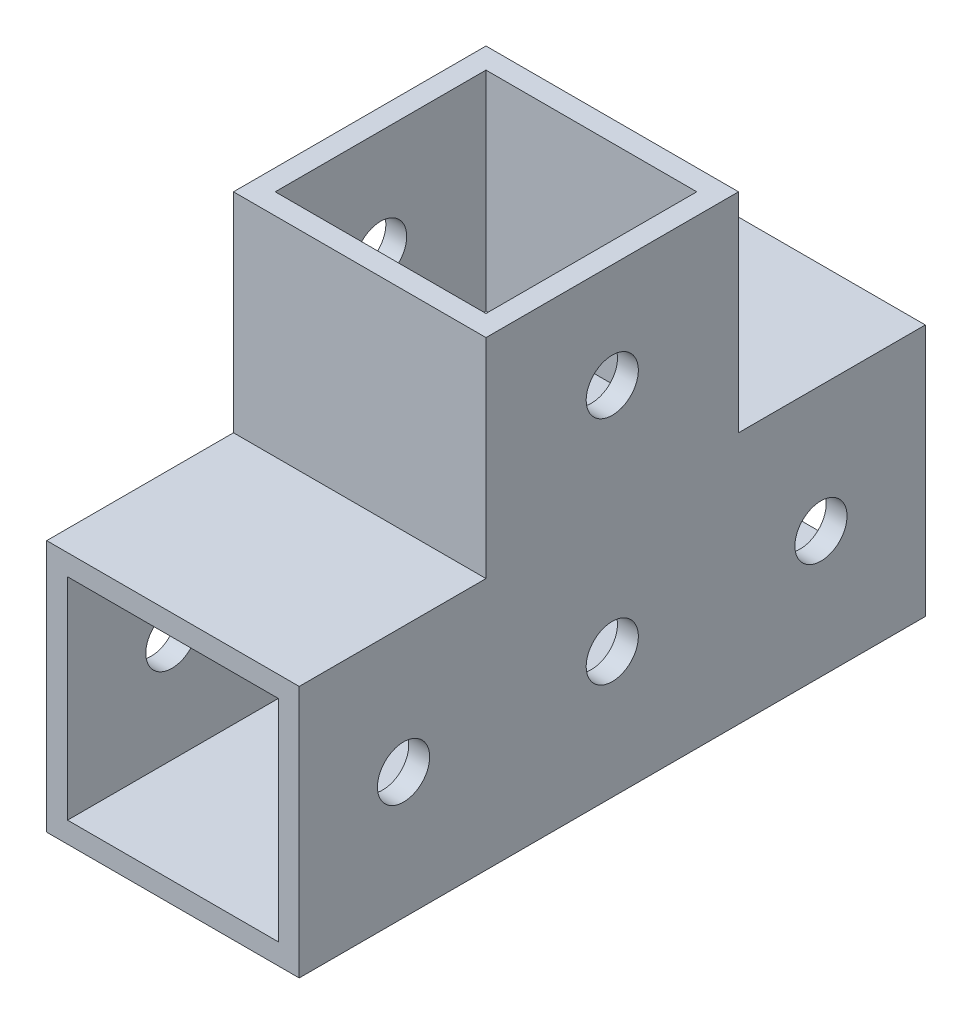
ISO-10303-21;
HEADER;
FILE_DESCRIPTION(('STEP AP214'),'2;1');
FILE_NAME('part.step','',(''),(''),'','','');
FILE_SCHEMA(('AUTOMOTIVE_DESIGN { 1 0 10303 214 1 1 1 1 }'));
ENDSEC;
DATA;
#1=APPLICATION_CONTEXT('core data for automotive mechanical design processes');
#2=APPLICATION_PROTOCOL_DEFINITION('international standard','automotive_design',2000,#1);
#3=PRODUCT_CONTEXT('',#1,'mechanical');
#4=PRODUCT('Part','Part','',(#3));
#5=PRODUCT_RELATED_PRODUCT_CATEGORY('part','',(#4));
#6=PRODUCT_DEFINITION_FORMATION('','',#4);
#7=PRODUCT_DEFINITION_CONTEXT('part definition',#1,'design');
#8=PRODUCT_DEFINITION('design','',#6,#7);
#9=PRODUCT_DEFINITION_SHAPE('','',#8);
#10=(LENGTH_UNIT() NAMED_UNIT(*) SI_UNIT(.MILLI.,.METRE.));
#11=(NAMED_UNIT(*) PLANE_ANGLE_UNIT() SI_UNIT($,.RADIAN.));
#12=(NAMED_UNIT(*) SI_UNIT($,.STERADIAN.) SOLID_ANGLE_UNIT());
#13=UNCERTAINTY_MEASURE_WITH_UNIT(LENGTH_MEASURE(1.E-05),#10,'distance_accuracy_value','');
#14=(GEOMETRIC_REPRESENTATION_CONTEXT(3) GLOBAL_UNCERTAINTY_ASSIGNED_CONTEXT((#13)) GLOBAL_UNIT_ASSIGNED_CONTEXT((#10,
#11,#12)) REPRESENTATION_CONTEXT('',''));
#15=CARTESIAN_POINT('',(0.,0.,0.));
#16=DIRECTION('',(0.,0.,1.));
#17=DIRECTION('',(1.,0.,0.));
#18=AXIS2_PLACEMENT_3D('',#15,#16,#17);
#19=CARTESIAN_POINT('',(-12.1,12.1,100.));
#20=DIRECTION('',(0.,-1.,0.));
#21=DIRECTION('',(1.,0.,0.));
#22=AXIS2_PLACEMENT_3D('',#19,#20,#21);
#23=PLANE('',#22);
#24=DIRECTION('',(1.,0.,0.));
#25=VECTOR('',#24,1.);
#26=CARTESIAN_POINT('',(-27.9,12.1,80.));
#27=LINE('',#26,#25);
#28=CARTESIAN_POINT('',(-12.1,12.1,80.));
#29=VERTEX_POINT('',#28);
#30=CARTESIAN_POINT('',(12.1,12.1,80.));
#31=VERTEX_POINT('',#30);
#32=EDGE_CURVE('E295',#29,#31,#27,.T.);
#33=ORIENTED_EDGE('',*,*,#32,.T.);
#34=DIRECTION('',(0.,0.,-1.));
#35=VECTOR('',#34,1.);
#36=CARTESIAN_POINT('',(12.1,12.1,100.));
#37=LINE('',#36,#35);
#38=CARTESIAN_POINT('',(12.1,12.1,62.1));
#39=VERTEX_POINT('',#38);
#40=EDGE_CURVE('E212',#31,#39,#37,.T.);
#41=ORIENTED_EDGE('',*,*,#40,.T.);
#42=DIRECTION('',(1.,0.,0.));
#43=VECTOR('',#42,1.);
#44=CARTESIAN_POINT('',(-12.1,12.1,62.1));
#45=LINE('',#44,#43);
#46=CARTESIAN_POINT('',(-12.1,12.1,62.1));
#47=VERTEX_POINT('',#46);
#48=EDGE_CURVE('E179',#47,#39,#45,.T.);
#49=ORIENTED_EDGE('',*,*,#48,.F.);
#50=DIRECTION('',(0.,0.,-1.));
#51=VECTOR('',#50,1.);
#52=CARTESIAN_POINT('',(-12.1,12.1,100.));
#53=LINE('',#52,#51);
#54=EDGE_CURVE('E207',#29,#47,#53,.T.);
#55=ORIENTED_EDGE('',*,*,#54,.F.);
#56=EDGE_LOOP('',(#33,#41,#49,#55));
#57=FACE_BOUND('',#56,.T.);
#58=ADVANCED_FACE('F45',(#57),#23,.F.);
#59=CARTESIAN_POINT('',(-12.1,-12.1,100.));
#60=DIRECTION('',(1.,0.,0.));
#61=DIRECTION('',(0.,0.,-1.));
#62=AXIS2_PLACEMENT_3D('',#59,#60,#61);
#63=PLANE('',#62);
#64=CARTESIAN_POINT('',(-12.1,2.22044604925031E-13,70.0000000000004));
#65=DIRECTION('',(-1.,0.,0.));
#66=DIRECTION('',(0.,0.,-1.));
#67=AXIS2_PLACEMENT_3D('',#64,#65,#66);
#68=CIRCLE('',#67,2.50000000000002);
#69=CARTESIAN_POINT('',(-12.1,2.22044604925031E-13,67.5000000000004));
#70=VERTEX_POINT('',#69);
#71=EDGE_CURVE('E324',#70,#70,#68,.T.);
#72=ORIENTED_EDGE('',*,*,#71,.F.);
#73=EDGE_LOOP('',(#72));
#74=FACE_BOUND('',#73,.T.);
#75=CARTESIAN_POINT('',(-12.1,0.,30.));
#76=DIRECTION('',(-1.,0.,0.));
#77=DIRECTION('',(0.,0.,1.));
#78=AXIS2_PLACEMENT_3D('',#75,#76,#77);
#79=CIRCLE('',#78,2.5);
#80=CARTESIAN_POINT('',(-12.1,0.,32.5));
#81=VERTEX_POINT('',#80);
#82=EDGE_CURVE('E229',#81,#81,#79,.T.);
#83=ORIENTED_EDGE('',*,*,#82,.F.);
#84=EDGE_LOOP('',(#83));
#85=FACE_BOUND('',#84,.T.);
#86=CARTESIAN_POINT('',(-12.1,22.1,50.));
#87=DIRECTION('',(-1.,0.,0.));
#88=DIRECTION('',(0.,0.,1.));
#89=AXIS2_PLACEMENT_3D('',#86,#87,#88);
#90=CIRCLE('',#89,2.5);
#91=CARTESIAN_POINT('',(-12.1,22.1,52.5));
#92=VERTEX_POINT('',#91);
#93=EDGE_CURVE('E320',#92,#92,#90,.T.);
#94=ORIENTED_EDGE('',*,*,#93,.F.);
#95=EDGE_LOOP('',(#94));
#96=FACE_BOUND('',#95,.T.);
#97=CARTESIAN_POINT('',(-12.1,0.,50.0000000000056));
#98=DIRECTION('',(1.,0.,0.));
#99=DIRECTION('',(0.,0.,-1.));
#100=AXIS2_PLACEMENT_3D('',#97,#98,#99);
#101=CIRCLE('',#100,2.5);
#102=CARTESIAN_POINT('',(-12.1,0.,47.5000000000056));
#103=VERTEX_POINT('',#102);
#104=EDGE_CURVE('E316',#103,#103,#101,.T.);
#105=ORIENTED_EDGE('',*,*,#104,.T.);
#106=EDGE_LOOP('',(#105));
#107=FACE_BOUND('',#106,.T.);
#108=DIRECTION('',(0.,-1.,0.));
#109=VECTOR('',#108,1.);
#110=CARTESIAN_POINT('',(-12.1,52.1,62.1));
#111=LINE('',#110,#109);
#112=CARTESIAN_POINT('',(-12.1,32.1,62.1));
#113=VERTEX_POINT('',#112);
#114=EDGE_CURVE('E181',#113,#47,#111,.T.);
#115=ORIENTED_EDGE('',*,*,#114,.F.);
#116=DIRECTION('',(0.,0.,-1.));
#117=VECTOR('',#116,1.);
#118=CARTESIAN_POINT('',(-12.1,32.1,100.));
#119=LINE('',#118,#117);
#120=CARTESIAN_POINT('',(-12.1,32.1,37.9));
#121=VERTEX_POINT('',#120);
#122=EDGE_CURVE('E159',#113,#121,#119,.T.);
#123=ORIENTED_EDGE('',*,*,#122,.T.);
#124=DIRECTION('',(0.,-1.,0.));
#125=VECTOR('',#124,1.);
#126=CARTESIAN_POINT('',(-12.1,52.1,37.9));
#127=LINE('',#126,#125);
#128=CARTESIAN_POINT('',(-12.1,12.1,37.9));
#129=VERTEX_POINT('',#128);
#130=EDGE_CURVE('E187',#121,#129,#127,.T.);
#131=ORIENTED_EDGE('',*,*,#130,.T.);
#132=CARTESIAN_POINT('',(-12.1,12.1,19.9999999999997));
#133=VERTEX_POINT('',#132);
#134=EDGE_CURVE('E206',#129,#133,#53,.T.);
#135=ORIENTED_EDGE('',*,*,#134,.T.);
#136=DIRECTION('',(0.,-1.,0.));
#137=VECTOR('',#136,1.);
#138=CARTESIAN_POINT('',(-12.1,-12.0999999999995,19.9999999999996));
#139=LINE('',#138,#137);
#140=CARTESIAN_POINT('',(-12.1,-12.1,19.9999999999996));
#141=VERTEX_POINT('',#140);
#142=EDGE_CURVE('E269',#133,#141,#139,.T.);
#143=ORIENTED_EDGE('',*,*,#142,.T.);
#144=DIRECTION('',(0.,0.,-1.));
#145=VECTOR('',#144,1.);
#146=CARTESIAN_POINT('',(-12.1,-12.1,100.));
#147=LINE('',#146,#145);
#148=CARTESIAN_POINT('',(-12.1,-12.1,80.));
#149=VERTEX_POINT('',#148);
#150=EDGE_CURVE('E219',#149,#141,#147,.T.);
#151=ORIENTED_EDGE('',*,*,#150,.F.);
#152=DIRECTION('',(0.,-1.,0.));
#153=VECTOR('',#152,1.);
#154=CARTESIAN_POINT('',(-12.1,-12.1,80.));
#155=LINE('',#154,#153);
#156=EDGE_CURVE('E300',#29,#149,#155,.T.);
#157=ORIENTED_EDGE('',*,*,#156,.F.);
#158=ORIENTED_EDGE('',*,*,#54,.T.);
#159=EDGE_LOOP('',(#115,#123,#131,#135,#143,#151,#157,#158));
#160=FACE_BOUND('',#159,.T.);
#161=ADVANCED_FACE('F47',(#74,#85,#96,#107,#160),#63,.F.);
#162=CARTESIAN_POINT('',(-12.1,-12.1,100.));
#163=DIRECTION('',(0.,1.,0.));
#164=DIRECTION('',(0.,0.,1.));
#165=AXIS2_PLACEMENT_3D('',#162,#163,#164);
#166=PLANE('',#165);
#167=ORIENTED_EDGE('',*,*,#150,.T.);
#168=DIRECTION('',(1.,0.,0.));
#169=VECTOR('',#168,1.);
#170=CARTESIAN_POINT('',(-27.9,-12.1,19.9999999999996));
#171=LINE('',#170,#169);
#172=CARTESIAN_POINT('',(12.1,-12.1,19.9999999999996));
#173=VERTEX_POINT('',#172);
#174=EDGE_CURVE('E286',#141,#173,#171,.T.);
#175=ORIENTED_EDGE('',*,*,#174,.T.);
#176=DIRECTION('',(0.,0.,-1.));
#177=VECTOR('',#176,1.);
#178=CARTESIAN_POINT('',(12.1,-12.1,100.));
#179=LINE('',#178,#177);
#180=CARTESIAN_POINT('',(12.1,-12.1,80.));
#181=VERTEX_POINT('',#180);
#182=EDGE_CURVE('E215',#181,#173,#179,.T.);
#183=ORIENTED_EDGE('',*,*,#182,.F.);
#184=DIRECTION('',(1.,0.,0.));
#185=VECTOR('',#184,1.);
#186=CARTESIAN_POINT('',(-27.9,-12.1,80.));
#187=LINE('',#186,#185);
#188=EDGE_CURVE('E412',#149,#181,#187,.T.);
#189=ORIENTED_EDGE('',*,*,#188,.F.);
#190=EDGE_LOOP('',(#167,#175,#183,#189));
#191=FACE_BOUND('',#190,.T.);
#192=ADVANCED_FACE('F428',(#191),#166,.F.);
#193=CARTESIAN_POINT('',(12.1,-12.1,100.));
#194=DIRECTION('',(-1.,0.,0.));
#195=DIRECTION('',(0.,-1.,0.));
#196=AXIS2_PLACEMENT_3D('',#193,#194,#195);
#197=PLANE('',#196);
#198=CARTESIAN_POINT('',(12.1,2.22044604925031E-13,70.0000000000004));
#199=DIRECTION('',(-1.,0.,0.));
#200=DIRECTION('',(0.,-1.,0.));
#201=AXIS2_PLACEMENT_3D('',#198,#199,#200);
#202=CIRCLE('',#201,2.50000000000002);
#203=CARTESIAN_POINT('',(12.1,-2.4999999999998,70.0000000000004));
#204=VERTEX_POINT('',#203);
#205=EDGE_CURVE('E241',#204,#204,#202,.T.);
#206=ORIENTED_EDGE('',*,*,#205,.T.);
#207=EDGE_LOOP('',(#206));
#208=FACE_BOUND('',#207,.T.);
#209=CARTESIAN_POINT('',(12.1,0.,30.));
#210=DIRECTION('',(-1.,0.,0.));
#211=DIRECTION('',(0.,-1.,0.));
#212=AXIS2_PLACEMENT_3D('',#209,#210,#211);
#213=CIRCLE('',#212,2.5);
#214=CARTESIAN_POINT('',(12.1,-2.5,30.));
#215=VERTEX_POINT('',#214);
#216=EDGE_CURVE('E346',#215,#215,#213,.T.);
#217=ORIENTED_EDGE('',*,*,#216,.T.);
#218=EDGE_LOOP('',(#217));
#219=FACE_BOUND('',#218,.T.);
#220=CARTESIAN_POINT('',(12.1,22.1,50.));
#221=DIRECTION('',(-1.,0.,0.));
#222=DIRECTION('',(0.,-1.,0.));
#223=AXIS2_PLACEMENT_3D('',#220,#221,#222);
#224=CIRCLE('',#223,2.5);
#225=CARTESIAN_POINT('',(12.1,19.6,50.));
#226=VERTEX_POINT('',#225);
#227=EDGE_CURVE('E235',#226,#226,#224,.T.);
#228=ORIENTED_EDGE('',*,*,#227,.T.);
#229=EDGE_LOOP('',(#228));
#230=FACE_BOUND('',#229,.T.);
#231=CARTESIAN_POINT('',(12.1,0.,50.0000000000056));
#232=DIRECTION('',(1.,0.,0.));
#233=DIRECTION('',(0.,1.,0.));
#234=AXIS2_PLACEMENT_3D('',#231,#232,#233);
#235=CIRCLE('',#234,2.5);
#236=CARTESIAN_POINT('',(12.1,2.5,50.0000000000056));
#237=VERTEX_POINT('',#236);
#238=EDGE_CURVE('E247',#237,#237,#235,.T.);
#239=ORIENTED_EDGE('',*,*,#238,.F.);
#240=EDGE_LOOP('',(#239));
#241=FACE_BOUND('',#240,.T.);
#242=DIRECTION('',(0.,-1.,0.));
#243=VECTOR('',#242,1.);
#244=CARTESIAN_POINT('',(12.1,52.1,37.9));
#245=LINE('',#244,#243);
#246=CARTESIAN_POINT('',(12.1,32.1,37.9));
#247=VERTEX_POINT('',#246);
#248=CARTESIAN_POINT('',(12.1,12.1,37.9));
#249=VERTEX_POINT('',#248);
#250=EDGE_CURVE('E173',#247,#249,#245,.T.);
#251=ORIENTED_EDGE('',*,*,#250,.F.);
#252=DIRECTION('',(0.,0.,-1.));
#253=VECTOR('',#252,1.);
#254=CARTESIAN_POINT('',(12.1,32.1,0.));
#255=LINE('',#254,#253);
#256=CARTESIAN_POINT('',(12.1,32.1,62.1));
#257=VERTEX_POINT('',#256);
#258=EDGE_CURVE('E61',#257,#247,#255,.T.);
#259=ORIENTED_EDGE('',*,*,#258,.F.);
#260=DIRECTION('',(0.,-1.,0.));
#261=VECTOR('',#260,1.);
#262=CARTESIAN_POINT('',(12.1,52.1,62.1));
#263=LINE('',#262,#261);
#264=EDGE_CURVE('E170',#257,#39,#263,.T.);
#265=ORIENTED_EDGE('',*,*,#264,.T.);
#266=ORIENTED_EDGE('',*,*,#40,.F.);
#267=DIRECTION('',(0.,-1.,0.));
#268=VECTOR('',#267,1.);
#269=CARTESIAN_POINT('',(12.1,0.,80.));
#270=LINE('',#269,#268);
#271=EDGE_CURVE('E409',#31,#181,#270,.T.);
#272=ORIENTED_EDGE('',*,*,#271,.T.);
#273=ORIENTED_EDGE('',*,*,#182,.T.);
#274=DIRECTION('',(0.,-1.,0.));
#275=VECTOR('',#274,1.);
#276=CARTESIAN_POINT('',(12.1,-1.32698735076462E-13,19.9999999999997));
#277=LINE('',#276,#275);
#278=CARTESIAN_POINT('',(12.1,12.1,19.9999999999997));
#279=VERTEX_POINT('',#278);
#280=EDGE_CURVE('E410',#279,#173,#277,.T.);
#281=ORIENTED_EDGE('',*,*,#280,.F.);
#282=EDGE_CURVE('E211',#249,#279,#37,.T.);
#283=ORIENTED_EDGE('',*,*,#282,.F.);
#284=EDGE_LOOP('',(#251,#259,#265,#266,#272,#273,#281,#283));
#285=FACE_BOUND('',#284,.T.);
#286=ADVANCED_FACE('F168',(#208,#219,#230,#241,#285),#197,.F.);
#287=CARTESIAN_POINT('',(10.1,-10.1,100.));
#288=DIRECTION('',(-1.,0.,0.));
#289=DIRECTION('',(0.,0.,1.));
#290=AXIS2_PLACEMENT_3D('',#287,#288,#289);
#291=PLANE('',#290);
#292=DIRECTION('',(0.,1.,0.));
#293=VECTOR('',#292,1.);
#294=CARTESIAN_POINT('',(10.1,-10.0999999999995,19.9999999999996));
#295=LINE('',#294,#293);
#296=CARTESIAN_POINT('',(10.1,-10.1,19.9999999999996));
#297=VERTEX_POINT('',#296);
#298=CARTESIAN_POINT('',(10.1,10.1,19.9999999999997));
#299=VERTEX_POINT('',#298);
#300=EDGE_CURVE('E256',#297,#299,#295,.T.);
#301=ORIENTED_EDGE('',*,*,#300,.F.);
#302=DIRECTION('',(0.,0.,-1.));
#303=VECTOR('',#302,1.);
#304=CARTESIAN_POINT('',(10.1,-10.1,100.));
#305=LINE('',#304,#303);
#306=CARTESIAN_POINT('',(10.1,-10.1,80.));
#307=VERTEX_POINT('',#306);
#308=EDGE_CURVE('E185',#307,#297,#305,.T.);
#309=ORIENTED_EDGE('',*,*,#308,.F.);
#310=DIRECTION('',(0.,1.,0.));
#311=VECTOR('',#310,1.);
#312=CARTESIAN_POINT('',(10.1,-10.1,80.));
#313=LINE('',#312,#311);
#314=CARTESIAN_POINT('',(10.1,10.1,80.));
#315=VERTEX_POINT('',#314);
#316=EDGE_CURVE('E279',#307,#315,#313,.T.);
#317=ORIENTED_EDGE('',*,*,#316,.T.);
#318=DIRECTION('',(0.,0.,-1.));
#319=VECTOR('',#318,1.);
#320=CARTESIAN_POINT('',(10.1,10.1,100.));
#321=LINE('',#320,#319);
#322=EDGE_CURVE('E202',#315,#299,#321,.T.);
#323=ORIENTED_EDGE('',*,*,#322,.T.);
#324=EDGE_LOOP('',(#301,#309,#317,#323));
#325=FACE_BOUND('',#324,.T.);
#326=CARTESIAN_POINT('',(10.1,2.22044604925031E-13,70.0000000000004));
#327=DIRECTION('',(-1.,0.,0.));
#328=DIRECTION('',(0.,0.,1.));
#329=AXIS2_PLACEMENT_3D('',#326,#327,#328);
#330=CIRCLE('',#329,2.50000000000002);
#331=CARTESIAN_POINT('',(10.1,2.22044604925031E-13,72.5000000000004));
#332=VERTEX_POINT('',#331);
#333=EDGE_CURVE('E234',#332,#332,#330,.T.);
#334=ORIENTED_EDGE('',*,*,#333,.F.);
#335=EDGE_LOOP('',(#334));
#336=FACE_BOUND('',#335,.T.);
#337=CARTESIAN_POINT('',(10.1,0.,30.));
#338=DIRECTION('',(-1.,0.,0.));
#339=DIRECTION('',(0.,0.,1.));
#340=AXIS2_PLACEMENT_3D('',#337,#338,#339);
#341=CIRCLE('',#340,2.5);
#342=CARTESIAN_POINT('',(10.1,0.,32.5));
#343=VERTEX_POINT('',#342);
#344=EDGE_CURVE('E240',#343,#343,#341,.T.);
#345=ORIENTED_EDGE('',*,*,#344,.F.);
#346=EDGE_LOOP('',(#345));
#347=FACE_BOUND('',#346,.T.);
#348=CARTESIAN_POINT('',(10.1,0.,50.0000000000056));
#349=DIRECTION('',(-1.,0.,0.));
#350=DIRECTION('',(0.,0.,1.));
#351=AXIS2_PLACEMENT_3D('',#348,#349,#350);
#352=CIRCLE('',#351,2.5);
#353=CARTESIAN_POINT('',(10.1,0.,52.5000000000056));
#354=VERTEX_POINT('',#353);
#355=EDGE_CURVE('E246',#354,#354,#352,.T.);
#356=ORIENTED_EDGE('',*,*,#355,.F.);
#357=EDGE_LOOP('',(#356));
#358=FACE_BOUND('',#357,.T.);
#359=ADVANCED_FACE('F264',(#325,#336,#347,#358),#291,.T.);
#360=CARTESIAN_POINT('',(-10.1,10.1,100.));
#361=DIRECTION('',(0.,-1.,0.));
#362=DIRECTION('',(0.,0.,-1.));
#363=AXIS2_PLACEMENT_3D('',#360,#361,#362);
#364=PLANE('',#363);
#365=DIRECTION('',(-1.,0.,0.));
#366=VECTOR('',#365,1.);
#367=CARTESIAN_POINT('',(-10.1,10.1,19.9999999999997));
#368=LINE('',#367,#366);
#369=CARTESIAN_POINT('',(-10.1,10.1,19.9999999999997));
#370=VERTEX_POINT('',#369);
#371=EDGE_CURVE('E270',#299,#370,#368,.T.);
#372=ORIENTED_EDGE('',*,*,#371,.F.);
#373=ORIENTED_EDGE('',*,*,#322,.F.);
#374=DIRECTION('',(-1.,0.,0.));
#375=VECTOR('',#374,1.);
#376=CARTESIAN_POINT('',(-10.1,10.1,80.));
#377=LINE('',#376,#375);
#378=CARTESIAN_POINT('',(-10.1,10.1,80.));
#379=VERTEX_POINT('',#378);
#380=EDGE_CURVE('E285',#315,#379,#377,.T.);
#381=ORIENTED_EDGE('',*,*,#380,.T.);
#382=DIRECTION('',(0.,0.,-1.));
#383=VECTOR('',#382,1.);
#384=CARTESIAN_POINT('',(-10.1,10.1,100.));
#385=LINE('',#384,#383);
#386=EDGE_CURVE('E198',#379,#370,#385,.T.);
#387=ORIENTED_EDGE('',*,*,#386,.T.);
#388=EDGE_LOOP('',(#372,#373,#381,#387));
#389=FACE_BOUND('',#388,.T.);
#390=ADVANCED_FACE('F577',(#389),#364,.T.);
#391=CARTESIAN_POINT('',(-10.1,-10.1,100.));
#392=DIRECTION('',(1.,0.,0.));
#393=DIRECTION('',(0.,0.,-1.));
#394=AXIS2_PLACEMENT_3D('',#391,#392,#393);
#395=PLANE('',#394);
#396=DIRECTION('',(0.,-1.,0.));
#397=VECTOR('',#396,1.);
#398=CARTESIAN_POINT('',(-10.1,-10.0999999999995,19.9999999999996));
#399=LINE('',#398,#397);
#400=CARTESIAN_POINT('',(-10.1,-10.1,19.9999999999996));
#401=VERTEX_POINT('',#400);
#402=EDGE_CURVE('E259',#370,#401,#399,.T.);
#403=ORIENTED_EDGE('',*,*,#402,.F.);
#404=ORIENTED_EDGE('',*,*,#386,.F.);
#405=DIRECTION('',(0.,-1.,0.));
#406=VECTOR('',#405,1.);
#407=CARTESIAN_POINT('',(-10.1,-10.1,80.));
#408=LINE('',#407,#406);
#409=CARTESIAN_POINT('',(-10.1,-10.1,80.));
#410=VERTEX_POINT('',#409);
#411=EDGE_CURVE('E277',#379,#410,#408,.T.);
#412=ORIENTED_EDGE('',*,*,#411,.T.);
#413=DIRECTION('',(0.,0.,-1.));
#414=VECTOR('',#413,1.);
#415=CARTESIAN_POINT('',(-10.1,-10.1,100.));
#416=LINE('',#415,#414);
#417=EDGE_CURVE('E194',#410,#401,#416,.T.);
#418=ORIENTED_EDGE('',*,*,#417,.T.);
#419=EDGE_LOOP('',(#403,#404,#412,#418));
#420=FACE_BOUND('',#419,.T.);
#421=CARTESIAN_POINT('',(-10.1,2.22044604925031E-13,70.0000000000004));
#422=DIRECTION('',(1.,0.,0.));
#423=DIRECTION('',(0.,0.,-1.));
#424=AXIS2_PLACEMENT_3D('',#421,#422,#423);
#425=CIRCLE('',#424,2.50000000000002);
#426=CARTESIAN_POINT('',(-10.1,2.22044604925031E-13,67.5000000000004));
#427=VERTEX_POINT('',#426);
#428=EDGE_CURVE('E230',#427,#427,#425,.T.);
#429=ORIENTED_EDGE('',*,*,#428,.F.);
#430=EDGE_LOOP('',(#429));
#431=FACE_BOUND('',#430,.T.);
#432=CARTESIAN_POINT('',(-10.1,0.,30.));
#433=DIRECTION('',(1.,0.,0.));
#434=DIRECTION('',(0.,0.,-1.));
#435=AXIS2_PLACEMENT_3D('',#432,#433,#434);
#436=CIRCLE('',#435,2.5);
#437=CARTESIAN_POINT('',(-10.1,0.,27.5));
#438=VERTEX_POINT('',#437);
#439=EDGE_CURVE('E236',#438,#438,#436,.T.);
#440=ORIENTED_EDGE('',*,*,#439,.F.);
#441=EDGE_LOOP('',(#440));
#442=FACE_BOUND('',#441,.T.);
#443=CARTESIAN_POINT('',(-10.1,0.,50.0000000000056));
#444=DIRECTION('',(1.,0.,0.));
#445=DIRECTION('',(0.,0.,-1.));
#446=AXIS2_PLACEMENT_3D('',#443,#444,#445);
#447=CIRCLE('',#446,2.5);
#448=CARTESIAN_POINT('',(-10.1,0.,47.5000000000056));
#449=VERTEX_POINT('',#448);
#450=EDGE_CURVE('E242',#449,#449,#447,.T.);
#451=ORIENTED_EDGE('',*,*,#450,.F.);
#452=EDGE_LOOP('',(#451));
#453=FACE_BOUND('',#452,.T.);
#454=ADVANCED_FACE('F282',(#420,#431,#442,#453),#395,.T.);
#455=CARTESIAN_POINT('',(-10.1,-10.1,100.));
#456=DIRECTION('',(0.,1.,0.));
#457=DIRECTION('',(0.,0.,1.));
#458=AXIS2_PLACEMENT_3D('',#455,#456,#457);
#459=PLANE('',#458);
#460=DIRECTION('',(1.,0.,0.));
#461=VECTOR('',#460,1.);
#462=CARTESIAN_POINT('',(-10.1,-10.1,19.9999999999996));
#463=LINE('',#462,#461);
#464=EDGE_CURVE('E54',#401,#297,#463,.T.);
#465=ORIENTED_EDGE('',*,*,#464,.F.);
#466=ORIENTED_EDGE('',*,*,#417,.F.);
#467=DIRECTION('',(1.,0.,0.));
#468=VECTOR('',#467,1.);
#469=CARTESIAN_POINT('',(-10.1,-10.1,80.));
#470=LINE('',#469,#468);
#471=EDGE_CURVE('E223',#410,#307,#470,.T.);
#472=ORIENTED_EDGE('',*,*,#471,.T.);
#473=ORIENTED_EDGE('',*,*,#308,.T.);
#474=EDGE_LOOP('',(#465,#466,#472,#473));
#475=FACE_BOUND('',#474,.T.);
#476=ADVANCED_FACE('F272',(#475),#459,.T.);
#477=ORIENTED_EDGE('',*,*,#282,.T.);
#478=DIRECTION('',(1.,0.,0.));
#479=VECTOR('',#478,1.);
#480=CARTESIAN_POINT('',(-27.9,12.1,19.9999999999997));
#481=LINE('',#480,#479);
#482=EDGE_CURVE('E292',#133,#279,#481,.T.);
#483=ORIENTED_EDGE('',*,*,#482,.F.);
#484=ORIENTED_EDGE('',*,*,#134,.F.);
#485=DIRECTION('',(-1.,0.,0.));
#486=VECTOR('',#485,1.);
#487=CARTESIAN_POINT('',(-12.1,12.1,37.9));
#488=LINE('',#487,#486);
#489=EDGE_CURVE('E380',#249,#129,#488,.T.);
#490=ORIENTED_EDGE('',*,*,#489,.F.);
#491=EDGE_LOOP('',(#477,#483,#484,#490));
#492=FACE_BOUND('',#491,.T.);
#493=ADVANCED_FACE('F393',(#492),#23,.F.);
#494=CARTESIAN_POINT('',(-12.1,52.1,62.1));
#495=DIRECTION('',(0.,0.,-1.));
#496=DIRECTION('',(-1.,0.,0.));
#497=AXIS2_PLACEMENT_3D('',#494,#495,#496);
#498=PLANE('',#497);
#499=ORIENTED_EDGE('',*,*,#264,.F.);
#500=DIRECTION('',(1.,0.,0.));
#501=VECTOR('',#500,1.);
#502=CARTESIAN_POINT('',(-27.9,32.1,62.1));
#503=LINE('',#502,#501);
#504=EDGE_CURVE('E156',#113,#257,#503,.T.);
#505=ORIENTED_EDGE('',*,*,#504,.F.);
#506=ORIENTED_EDGE('',*,*,#114,.T.);
#507=ORIENTED_EDGE('',*,*,#48,.T.);
#508=EDGE_LOOP('',(#499,#505,#506,#507));
#509=FACE_BOUND('',#508,.T.);
#510=ADVANCED_FACE('F177',(#509),#498,.F.);
#511=CARTESIAN_POINT('',(-12.1,52.1,37.9));
#512=DIRECTION('',(0.,0.,1.));
#513=DIRECTION('',(1.,0.,0.));
#514=AXIS2_PLACEMENT_3D('',#511,#512,#513);
#515=PLANE('',#514);
#516=ORIENTED_EDGE('',*,*,#130,.F.);
#517=DIRECTION('',(1.,0.,0.));
#518=VECTOR('',#517,1.);
#519=CARTESIAN_POINT('',(-27.9,32.1,37.9));
#520=LINE('',#519,#518);
#521=EDGE_CURVE('E164',#121,#247,#520,.T.);
#522=ORIENTED_EDGE('',*,*,#521,.T.);
#523=ORIENTED_EDGE('',*,*,#250,.T.);
#524=ORIENTED_EDGE('',*,*,#489,.T.);
#525=EDGE_LOOP('',(#516,#522,#523,#524));
#526=FACE_BOUND('',#525,.T.);
#527=ADVANCED_FACE('F395',(#526),#515,.F.);
#528=CARTESIAN_POINT('',(10.1,52.1,60.1));
#529=DIRECTION('',(-1.,0.,0.));
#530=DIRECTION('',(0.,-1.,0.));
#531=AXIS2_PLACEMENT_3D('',#528,#529,#530);
#532=PLANE('',#531);
#533=DIRECTION('',(0.,0.,1.));
#534=VECTOR('',#533,1.);
#535=CARTESIAN_POINT('',(10.1,32.1,60.1));
#536=LINE('',#535,#534);
#537=CARTESIAN_POINT('',(10.1,32.1,39.9));
#538=VERTEX_POINT('',#537);
#539=CARTESIAN_POINT('',(10.1,32.1,60.1));
#540=VERTEX_POINT('',#539);
#541=EDGE_CURVE('E68',#538,#540,#536,.T.);
#542=ORIENTED_EDGE('',*,*,#541,.F.);
#543=DIRECTION('',(0.,-1.,0.));
#544=VECTOR('',#543,1.);
#545=CARTESIAN_POINT('',(10.1,52.1,39.9));
#546=LINE('',#545,#544);
#547=CARTESIAN_POINT('',(10.1,12.1,39.9));
#548=VERTEX_POINT('',#547);
#549=EDGE_CURVE('E375',#538,#548,#546,.T.);
#550=ORIENTED_EDGE('',*,*,#549,.T.);
#551=DIRECTION('',(0.,0.,-1.));
#552=VECTOR('',#551,1.);
#553=CARTESIAN_POINT('',(10.1,12.1,60.1));
#554=LINE('',#553,#552);
#555=CARTESIAN_POINT('',(10.1,12.1,60.1));
#556=VERTEX_POINT('',#555);
#557=EDGE_CURVE('E350',#556,#548,#554,.T.);
#558=ORIENTED_EDGE('',*,*,#557,.F.);
#559=DIRECTION('',(0.,-1.,0.));
#560=VECTOR('',#559,1.);
#561=CARTESIAN_POINT('',(10.1,52.1,60.1));
#562=LINE('',#561,#560);
#563=EDGE_CURVE('E366',#540,#556,#562,.T.);
#564=ORIENTED_EDGE('',*,*,#563,.F.);
#565=EDGE_LOOP('',(#542,#550,#558,#564));
#566=FACE_BOUND('',#565,.T.);
#567=CARTESIAN_POINT('',(10.1,22.1,50.));
#568=DIRECTION('',(-1.,0.,0.));
#569=DIRECTION('',(0.,-1.,0.));
#570=AXIS2_PLACEMENT_3D('',#567,#568,#569);
#571=CIRCLE('',#570,2.5);
#572=CARTESIAN_POINT('',(10.1,19.6,50.));
#573=VERTEX_POINT('',#572);
#574=EDGE_CURVE('E228',#573,#573,#571,.T.);
#575=ORIENTED_EDGE('',*,*,#574,.F.);
#576=EDGE_LOOP('',(#575));
#577=FACE_BOUND('',#576,.T.);
#578=ADVANCED_FACE('F477',(#566,#577),#532,.T.);
#579=CARTESIAN_POINT('',(-10.1,52.1,39.9));
#580=DIRECTION('',(0.,0.,1.));
#581=DIRECTION('',(1.,0.,0.));
#582=AXIS2_PLACEMENT_3D('',#579,#580,#581);
#583=PLANE('',#582);
#584=DIRECTION('',(1.,0.,0.));
#585=VECTOR('',#584,1.);
#586=CARTESIAN_POINT('',(-10.1,32.1,39.9));
#587=LINE('',#586,#585);
#588=CARTESIAN_POINT('',(-10.1,32.1,39.9));
#589=VERTEX_POINT('',#588);
#590=EDGE_CURVE('E400',#589,#538,#587,.T.);
#591=ORIENTED_EDGE('',*,*,#590,.F.);
#592=DIRECTION('',(0.,-1.,0.));
#593=VECTOR('',#592,1.);
#594=CARTESIAN_POINT('',(-10.1,52.1,39.9));
#595=LINE('',#594,#593);
#596=CARTESIAN_POINT('',(-10.1,12.1,39.9));
#597=VERTEX_POINT('',#596);
#598=EDGE_CURVE('E372',#589,#597,#595,.T.);
#599=ORIENTED_EDGE('',*,*,#598,.T.);
#600=DIRECTION('',(-1.,0.,0.));
#601=VECTOR('',#600,1.);
#602=CARTESIAN_POINT('',(-10.1,12.1,39.9));
#603=LINE('',#602,#601);
#604=EDGE_CURVE('E354',#548,#597,#603,.T.);
#605=ORIENTED_EDGE('',*,*,#604,.F.);
#606=ORIENTED_EDGE('',*,*,#549,.F.);
#607=EDGE_LOOP('',(#591,#599,#605,#606));
#608=FACE_BOUND('',#607,.T.);
#609=ADVANCED_FACE('F482',(#608),#583,.T.);
#610=CARTESIAN_POINT('',(-10.1,52.1,60.1));
#611=DIRECTION('',(1.,0.,0.));
#612=DIRECTION('',(0.,1.,0.));
#613=AXIS2_PLACEMENT_3D('',#610,#611,#612);
#614=PLANE('',#613);
#615=DIRECTION('',(0.,0.,-1.));
#616=VECTOR('',#615,1.);
#617=CARTESIAN_POINT('',(-10.1,32.1,60.1));
#618=LINE('',#617,#616);
#619=CARTESIAN_POINT('',(-10.1,32.1,60.1));
#620=VERTEX_POINT('',#619);
#621=EDGE_CURVE('E397',#620,#589,#618,.T.);
#622=ORIENTED_EDGE('',*,*,#621,.F.);
#623=DIRECTION('',(0.,-1.,0.));
#624=VECTOR('',#623,1.);
#625=CARTESIAN_POINT('',(-10.1,52.1,60.1));
#626=LINE('',#625,#624);
#627=CARTESIAN_POINT('',(-10.1,12.1,60.1));
#628=VERTEX_POINT('',#627);
#629=EDGE_CURVE('E369',#620,#628,#626,.T.);
#630=ORIENTED_EDGE('',*,*,#629,.T.);
#631=DIRECTION('',(0.,0.,1.));
#632=VECTOR('',#631,1.);
#633=CARTESIAN_POINT('',(-10.1,12.1,60.1));
#634=LINE('',#633,#632);
#635=EDGE_CURVE('E358',#597,#628,#634,.T.);
#636=ORIENTED_EDGE('',*,*,#635,.F.);
#637=ORIENTED_EDGE('',*,*,#598,.F.);
#638=EDGE_LOOP('',(#622,#630,#636,#637));
#639=FACE_BOUND('',#638,.T.);
#640=CARTESIAN_POINT('',(-10.1,22.1,50.));
#641=DIRECTION('',(1.,0.,0.));
#642=DIRECTION('',(0.,1.,0.));
#643=AXIS2_PLACEMENT_3D('',#640,#641,#642);
#644=CIRCLE('',#643,2.5);
#645=CARTESIAN_POINT('',(-10.1,24.6,50.));
#646=VERTEX_POINT('',#645);
#647=EDGE_CURVE('E224',#646,#646,#644,.T.);
#648=ORIENTED_EDGE('',*,*,#647,.F.);
#649=EDGE_LOOP('',(#648));
#650=FACE_BOUND('',#649,.T.);
#651=ADVANCED_FACE('F463',(#639,#650),#614,.T.);
#652=CARTESIAN_POINT('',(-10.1,52.1,60.1));
#653=DIRECTION('',(0.,0.,-1.));
#654=DIRECTION('',(-1.,0.,0.));
#655=AXIS2_PLACEMENT_3D('',#652,#653,#654);
#656=PLANE('',#655);
#657=DIRECTION('',(-1.,0.,0.));
#658=VECTOR('',#657,1.);
#659=CARTESIAN_POINT('',(-10.1,32.1,60.1));
#660=LINE('',#659,#658);
#661=EDGE_CURVE('E11',#540,#620,#660,.T.);
#662=ORIENTED_EDGE('',*,*,#661,.F.);
#663=ORIENTED_EDGE('',*,*,#563,.T.);
#664=DIRECTION('',(1.,0.,0.));
#665=VECTOR('',#664,1.);
#666=CARTESIAN_POINT('',(-10.1,12.1,60.1));
#667=LINE('',#666,#665);
#668=EDGE_CURVE('E362',#628,#556,#667,.T.);
#669=ORIENTED_EDGE('',*,*,#668,.F.);
#670=ORIENTED_EDGE('',*,*,#629,.F.);
#671=EDGE_LOOP('',(#662,#663,#669,#670));
#672=FACE_BOUND('',#671,.T.);
#673=ADVANCED_FACE('F454',(#672),#656,.T.);
#674=ORIENTED_EDGE('',*,*,#635,.T.);
#675=ORIENTED_EDGE('',*,*,#668,.T.);
#676=ORIENTED_EDGE('',*,*,#557,.T.);
#677=ORIENTED_EDGE('',*,*,#604,.T.);
#678=EDGE_LOOP('',(#674,#675,#676,#677));
#679=FACE_BOUND('',#678,.T.);
#680=ADVANCED_FACE('F444',(#679),#23,.F.);
#681=CARTESIAN_POINT('',(27.9,22.1,50.));
#682=DIRECTION('',(-1.,0.,0.));
#683=DIRECTION('',(0.,0.,1.));
#684=AXIS2_PLACEMENT_3D('',#681,#682,#683);
#685=CYLINDRICAL_SURFACE('',#684,2.5);
#686=ORIENTED_EDGE('',*,*,#647,.T.);
#687=EDGE_LOOP('',(#686));
#688=FACE_BOUND('',#687,.T.);
#689=ORIENTED_EDGE('',*,*,#93,.T.);
#690=EDGE_LOOP('',(#689));
#691=FACE_BOUND('',#690,.T.);
#692=ADVANCED_FACE('F453',(#688,#691),#685,.F.);
#693=ORIENTED_EDGE('',*,*,#574,.T.);
#694=EDGE_LOOP('',(#693));
#695=FACE_BOUND('',#694,.T.);
#696=ORIENTED_EDGE('',*,*,#227,.F.);
#697=EDGE_LOOP('',(#696));
#698=FACE_BOUND('',#697,.T.);
#699=ADVANCED_FACE('F459',(#695,#698),#685,.F.);
#700=CARTESIAN_POINT('',(27.9,2.22044604925031E-13,70.0000000000004));
#701=DIRECTION('',(-1.,0.,0.));
#702=DIRECTION('',(0.,0.,1.));
#703=AXIS2_PLACEMENT_3D('',#700,#701,#702);
#704=CYLINDRICAL_SURFACE('',#703,2.50000000000002);
#705=ORIENTED_EDGE('',*,*,#428,.T.);
#706=EDGE_LOOP('',(#705));
#707=FACE_BOUND('',#706,.T.);
#708=ORIENTED_EDGE('',*,*,#71,.T.);
#709=EDGE_LOOP('',(#708));
#710=FACE_BOUND('',#709,.T.);
#711=ADVANCED_FACE('F634',(#707,#710),#704,.F.);
#712=CARTESIAN_POINT('',(27.9,0.,30.));
#713=DIRECTION('',(-1.,0.,0.));
#714=DIRECTION('',(0.,0.,1.));
#715=AXIS2_PLACEMENT_3D('',#712,#713,#714);
#716=CYLINDRICAL_SURFACE('',#715,2.5);
#717=ORIENTED_EDGE('',*,*,#439,.T.);
#718=EDGE_LOOP('',(#717));
#719=FACE_BOUND('',#718,.T.);
#720=ORIENTED_EDGE('',*,*,#82,.T.);
#721=EDGE_LOOP('',(#720));
#722=FACE_BOUND('',#721,.T.);
#723=ADVANCED_FACE('F624',(#719,#722),#716,.F.);
#724=ORIENTED_EDGE('',*,*,#333,.T.);
#725=EDGE_LOOP('',(#724));
#726=FACE_BOUND('',#725,.T.);
#727=ORIENTED_EDGE('',*,*,#205,.F.);
#728=EDGE_LOOP('',(#727));
#729=FACE_BOUND('',#728,.T.);
#730=ADVANCED_FACE('F621',(#726,#729),#704,.F.);
#731=ORIENTED_EDGE('',*,*,#344,.T.);
#732=EDGE_LOOP('',(#731));
#733=FACE_BOUND('',#732,.T.);
#734=ORIENTED_EDGE('',*,*,#216,.F.);
#735=EDGE_LOOP('',(#734));
#736=FACE_BOUND('',#735,.T.);
#737=ADVANCED_FACE('F612',(#733,#736),#716,.F.);
#738=CARTESIAN_POINT('',(-27.9,0.,50.0000000000056));
#739=DIRECTION('',(1.,0.,0.));
#740=DIRECTION('',(0.,1.,0.));
#741=AXIS2_PLACEMENT_3D('',#738,#739,#740);
#742=CYLINDRICAL_SURFACE('',#741,2.5);
#743=ORIENTED_EDGE('',*,*,#450,.T.);
#744=EDGE_LOOP('',(#743));
#745=FACE_BOUND('',#744,.T.);
#746=ORIENTED_EDGE('',*,*,#104,.F.);
#747=EDGE_LOOP('',(#746));
#748=FACE_BOUND('',#747,.T.);
#749=ADVANCED_FACE('F439',(#745,#748),#742,.F.);
#750=ORIENTED_EDGE('',*,*,#355,.T.);
#751=EDGE_LOOP('',(#750));
#752=FACE_BOUND('',#751,.T.);
#753=ORIENTED_EDGE('',*,*,#238,.T.);
#754=EDGE_LOOP('',(#753));
#755=FACE_BOUND('',#754,.T.);
#756=ADVANCED_FACE('F431',(#752,#755),#742,.F.);
#757=CARTESIAN_POINT('',(-27.9,0.,80.));
#758=DIRECTION('',(0.,0.,1.));
#759=DIRECTION('',(1.,0.,0.));
#760=AXIS2_PLACEMENT_3D('',#757,#758,#759);
#761=PLANE('',#760);
#762=ORIENTED_EDGE('',*,*,#471,.F.);
#763=ORIENTED_EDGE('',*,*,#411,.F.);
#764=ORIENTED_EDGE('',*,*,#380,.F.);
#765=ORIENTED_EDGE('',*,*,#316,.F.);
#766=EDGE_LOOP('',(#762,#763,#764,#765));
#767=FACE_BOUND('',#766,.T.);
#768=ORIENTED_EDGE('',*,*,#156,.T.);
#769=ORIENTED_EDGE('',*,*,#188,.T.);
#770=ORIENTED_EDGE('',*,*,#271,.F.);
#771=ORIENTED_EDGE('',*,*,#32,.F.);
#772=EDGE_LOOP('',(#768,#769,#770,#771));
#773=FACE_BOUND('',#772,.T.);
#774=ADVANCED_FACE('F275',(#767,#773),#761,.T.);
#775=CARTESIAN_POINT('',(-27.9,-1.29831423545921E-13,19.9999999999997));
#776=DIRECTION('',(0.,0.,1.));
#777=DIRECTION('',(0.,-1.,0.));
#778=AXIS2_PLACEMENT_3D('',#775,#776,#777);
#779=PLANE('',#778);
#780=ORIENTED_EDGE('',*,*,#300,.T.);
#781=ORIENTED_EDGE('',*,*,#371,.T.);
#782=ORIENTED_EDGE('',*,*,#402,.T.);
#783=ORIENTED_EDGE('',*,*,#464,.T.);
#784=EDGE_LOOP('',(#780,#781,#782,#783));
#785=FACE_BOUND('',#784,.T.);
#786=ORIENTED_EDGE('',*,*,#482,.T.);
#787=ORIENTED_EDGE('',*,*,#280,.T.);
#788=ORIENTED_EDGE('',*,*,#174,.F.);
#789=ORIENTED_EDGE('',*,*,#142,.F.);
#790=EDGE_LOOP('',(#786,#787,#788,#789));
#791=FACE_BOUND('',#790,.T.);
#792=ADVANCED_FACE('F254',(#785,#791),#779,.F.);
#793=CARTESIAN_POINT('',(-27.9,32.1,0.));
#794=DIRECTION('',(0.,-1.,0.));
#795=DIRECTION('',(1.,0.,0.));
#796=AXIS2_PLACEMENT_3D('',#793,#794,#795);
#797=PLANE('',#796);
#798=ORIENTED_EDGE('',*,*,#541,.T.);
#799=ORIENTED_EDGE('',*,*,#661,.T.);
#800=ORIENTED_EDGE('',*,*,#621,.T.);
#801=ORIENTED_EDGE('',*,*,#590,.T.);
#802=EDGE_LOOP('',(#798,#799,#800,#801));
#803=FACE_BOUND('',#802,.T.);
#804=ORIENTED_EDGE('',*,*,#504,.T.);
#805=ORIENTED_EDGE('',*,*,#258,.T.);
#806=ORIENTED_EDGE('',*,*,#521,.F.);
#807=ORIENTED_EDGE('',*,*,#122,.F.);
#808=EDGE_LOOP('',(#804,#805,#806,#807));
#809=FACE_BOUND('',#808,.T.);
#810=ADVANCED_FACE('F157',(#803,#809),#797,.F.);
#811=CLOSED_SHELL('',(#58,#161,#192,#286,#359,#390,#454,#476,#493,#510,#527,#578,#609,#651,#673,
#680,#692,#699,#711,#723,#730,#737,#749,#756,#774,#792,#810));
#812=MANIFOLD_SOLID_BREP('B2',#811);
#813=ADVANCED_BREP_SHAPE_REPRESENTATION('',(#18,#812),#14);
#814=SHAPE_DEFINITION_REPRESENTATION(#9,#813);
ENDSEC;
END-ISO-10303-21;
